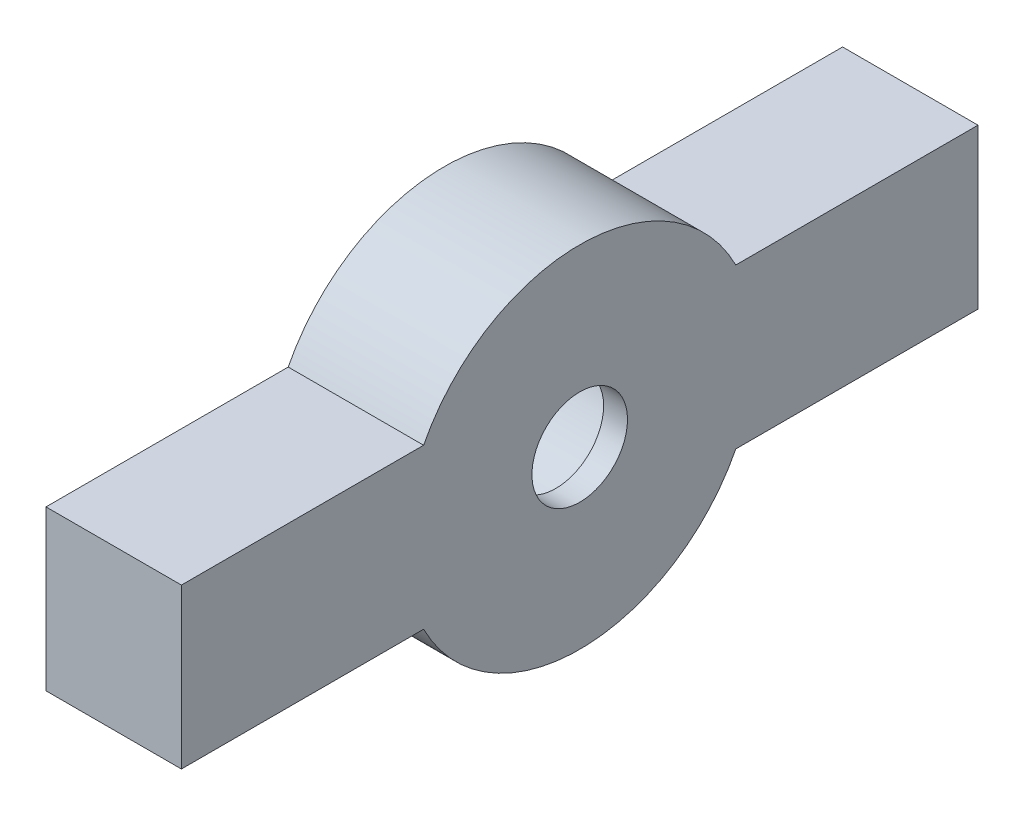
ISO-10303-21;
HEADER;
FILE_DESCRIPTION(('STEP AP214'),'2;1');
FILE_NAME('part.step','',(''),(''),'','','');
FILE_SCHEMA(('AUTOMOTIVE_DESIGN { 1 0 10303 214 1 1 1 1 }'));
ENDSEC;
DATA;
#1=APPLICATION_CONTEXT('core data for automotive mechanical design processes');
#2=APPLICATION_PROTOCOL_DEFINITION('international standard','automotive_design',2000,#1);
#3=PRODUCT_CONTEXT('',#1,'mechanical');
#4=PRODUCT('Part','Part','',(#3));
#5=PRODUCT_RELATED_PRODUCT_CATEGORY('part','',(#4));
#6=PRODUCT_DEFINITION_FORMATION('','',#4);
#7=PRODUCT_DEFINITION_CONTEXT('part definition',#1,'design');
#8=PRODUCT_DEFINITION('design','',#6,#7);
#9=PRODUCT_DEFINITION_SHAPE('','',#8);
#10=(LENGTH_UNIT() NAMED_UNIT(*) SI_UNIT(.MILLI.,.METRE.));
#11=(NAMED_UNIT(*) PLANE_ANGLE_UNIT() SI_UNIT($,.RADIAN.));
#12=(NAMED_UNIT(*) SI_UNIT($,.STERADIAN.) SOLID_ANGLE_UNIT());
#13=UNCERTAINTY_MEASURE_WITH_UNIT(LENGTH_MEASURE(1.E-05),#10,'distance_accuracy_value','');
#14=(GEOMETRIC_REPRESENTATION_CONTEXT(3) GLOBAL_UNCERTAINTY_ASSIGNED_CONTEXT((#13)) GLOBAL_UNIT_ASSIGNED_CONTEXT((#10,
#11,#12)) REPRESENTATION_CONTEXT('',''));
#15=CARTESIAN_POINT('',(0.,0.,0.));
#16=DIRECTION('',(0.,0.,1.));
#17=DIRECTION('',(1.,0.,0.));
#18=AXIS2_PLACEMENT_3D('',#15,#16,#17);
#19=CARTESIAN_POINT('',(3.4,0.,0.));
#20=DIRECTION('',(-1.,0.,0.));
#21=DIRECTION('',(0.,0.,1.));
#22=AXIS2_PLACEMENT_3D('',#19,#20,#21);
#23=CYLINDRICAL_SURFACE('',#22,2.4);
#24=CARTESIAN_POINT('',(0.199999999999999,0.,0.));
#25=DIRECTION('',(1.,0.,0.));
#26=DIRECTION('',(0.,0.,-1.));
#27=AXIS2_PLACEMENT_3D('',#24,#25,#26);
#28=CIRCLE('',#27,2.4);
#29=CARTESIAN_POINT('',(0.199999999999999,0.,2.4));
#30=VERTEX_POINT('',#29);
#31=EDGE_CURVE('E11',#30,#30,#28,.F.);
#32=ORIENTED_EDGE('',*,*,#31,.T.);
#33=EDGE_LOOP('',(#32));
#34=FACE_BOUND('',#33,.T.);
#35=CARTESIAN_POINT('',(2.8,0.,0.));
#36=DIRECTION('',(1.,0.,0.));
#37=DIRECTION('',(0.,0.,-1.));
#38=AXIS2_PLACEMENT_3D('',#35,#36,#37);
#39=CIRCLE('',#38,2.4);
#40=CARTESIAN_POINT('',(2.8,0.,-2.4));
#41=VERTEX_POINT('',#40);
#42=EDGE_CURVE('E157',#41,#41,#39,.T.);
#43=ORIENTED_EDGE('',*,*,#42,.T.);
#44=EDGE_LOOP('',(#43));
#45=FACE_BOUND('',#44,.T.);
#46=ADVANCED_FACE('F47',(#34,#45),#23,.F.);
#47=CARTESIAN_POINT('',(3.4,0.,0.));
#48=DIRECTION('',(-1.,0.,0.));
#49=DIRECTION('',(0.,0.,1.));
#50=AXIS2_PLACEMENT_3D('',#47,#48,#49);
#51=CYLINDRICAL_SURFACE('',#50,4.4);
#52=CARTESIAN_POINT('',(0.,0.,0.));
#53=DIRECTION('',(1.,0.,0.));
#54=DIRECTION('',(0.,0.,-1.));
#55=AXIS2_PLACEMENT_3D('',#52,#53,#54);
#56=CIRCLE('',#55,4.4);
#57=CARTESIAN_POINT('',(0.,-2.,3.91918358845308));
#58=VERTEX_POINT('',#57);
#59=CARTESIAN_POINT('',(0.,-2.,-3.91918358845308));
#60=VERTEX_POINT('',#59);
#61=EDGE_CURVE('E153',#58,#60,#56,.T.);
#62=ORIENTED_EDGE('',*,*,#61,.T.);
#63=DIRECTION('',(-1.,0.,0.));
#64=VECTOR('',#63,1.);
#65=CARTESIAN_POINT('',(3.4,-2.,-3.91918358845308));
#66=LINE('',#65,#64);
#67=CARTESIAN_POINT('',(3.4,-2.,-3.91918358845308));
#68=VERTEX_POINT('',#67);
#69=EDGE_CURVE('E195',#68,#60,#66,.T.);
#70=ORIENTED_EDGE('',*,*,#69,.F.);
#71=CARTESIAN_POINT('',(3.4,0.,0.));
#72=DIRECTION('',(1.,0.,0.));
#73=DIRECTION('',(0.,0.,-1.));
#74=AXIS2_PLACEMENT_3D('',#71,#72,#73);
#75=CIRCLE('',#74,4.4);
#76=CARTESIAN_POINT('',(3.4,-2.,3.91918358845308));
#77=VERTEX_POINT('',#76);
#78=EDGE_CURVE('E105',#77,#68,#75,.T.);
#79=ORIENTED_EDGE('',*,*,#78,.F.);
#80=DIRECTION('',(-1.,0.,0.));
#81=VECTOR('',#80,1.);
#82=CARTESIAN_POINT('',(3.4,-2.,3.91918358845308));
#83=LINE('',#82,#81);
#84=EDGE_CURVE('E66',#77,#58,#83,.T.);
#85=ORIENTED_EDGE('',*,*,#84,.T.);
#86=EDGE_LOOP('',(#62,#70,#79,#85));
#87=FACE_BOUND('',#86,.T.);
#88=ADVANCED_FACE('F214',(#87),#51,.T.);
#89=CARTESIAN_POINT('',(3.4,-2.,0.));
#90=DIRECTION('',(0.,-1.,0.));
#91=DIRECTION('',(0.,0.,-1.));
#92=AXIS2_PLACEMENT_3D('',#89,#90,#91);
#93=PLANE('',#92);
#94=DIRECTION('',(0.,0.,1.));
#95=VECTOR('',#94,1.);
#96=CARTESIAN_POINT('',(0.,-2.,0.));
#97=LINE('',#96,#95);
#98=CARTESIAN_POINT('',(0.,-2.,-10.));
#99=VERTEX_POINT('',#98);
#100=EDGE_CURVE('E156',#99,#60,#97,.T.);
#101=ORIENTED_EDGE('',*,*,#100,.F.);
#102=DIRECTION('',(-1.,0.,0.));
#103=VECTOR('',#102,1.);
#104=CARTESIAN_POINT('',(3.4,-2.,-10.));
#105=LINE('',#104,#103);
#106=CARTESIAN_POINT('',(3.4,-2.,-10.));
#107=VERTEX_POINT('',#106);
#108=EDGE_CURVE('E192',#107,#99,#105,.T.);
#109=ORIENTED_EDGE('',*,*,#108,.F.);
#110=DIRECTION('',(0.,0.,1.));
#111=VECTOR('',#110,1.);
#112=CARTESIAN_POINT('',(3.4,-2.,0.));
#113=LINE('',#112,#111);
#114=EDGE_CURVE('E266',#107,#68,#113,.T.);
#115=ORIENTED_EDGE('',*,*,#114,.T.);
#116=ORIENTED_EDGE('',*,*,#69,.T.);
#117=EDGE_LOOP('',(#101,#109,#115,#116));
#118=FACE_BOUND('',#117,.T.);
#119=ADVANCED_FACE('F218',(#118),#93,.T.);
#120=CARTESIAN_POINT('',(3.4,0.,-10.));
#121=DIRECTION('',(0.,0.,-1.));
#122=DIRECTION('',(-1.,0.,0.));
#123=AXIS2_PLACEMENT_3D('',#120,#121,#122);
#124=PLANE('',#123);
#125=DIRECTION('',(0.,-1.,0.));
#126=VECTOR('',#125,1.);
#127=CARTESIAN_POINT('',(0.,0.,-10.));
#128=LINE('',#127,#126);
#129=CARTESIAN_POINT('',(0.,2.,-10.));
#130=VERTEX_POINT('',#129);
#131=EDGE_CURVE('E161',#130,#99,#128,.T.);
#132=ORIENTED_EDGE('',*,*,#131,.F.);
#133=DIRECTION('',(-1.,0.,0.));
#134=VECTOR('',#133,1.);
#135=CARTESIAN_POINT('',(3.4,2.,-10.));
#136=LINE('',#135,#134);
#137=CARTESIAN_POINT('',(3.4,2.,-10.));
#138=VERTEX_POINT('',#137);
#139=EDGE_CURVE('E189',#138,#130,#136,.T.);
#140=ORIENTED_EDGE('',*,*,#139,.F.);
#141=DIRECTION('',(0.,-1.,0.));
#142=VECTOR('',#141,1.);
#143=CARTESIAN_POINT('',(3.4,0.,-10.));
#144=LINE('',#143,#142);
#145=EDGE_CURVE('E269',#138,#107,#144,.T.);
#146=ORIENTED_EDGE('',*,*,#145,.T.);
#147=ORIENTED_EDGE('',*,*,#108,.T.);
#148=EDGE_LOOP('',(#132,#140,#146,#147));
#149=FACE_BOUND('',#148,.T.);
#150=ADVANCED_FACE('F224',(#149),#124,.T.);
#151=CARTESIAN_POINT('',(3.4,2.,0.));
#152=DIRECTION('',(0.,-1.,0.));
#153=DIRECTION('',(0.,0.,-1.));
#154=AXIS2_PLACEMENT_3D('',#151,#152,#153);
#155=PLANE('',#154);
#156=DIRECTION('',(0.,0.,1.));
#157=VECTOR('',#156,1.);
#158=CARTESIAN_POINT('',(0.,2.,0.));
#159=LINE('',#158,#157);
#160=CARTESIAN_POINT('',(0.,2.,-3.91918358845308));
#161=VERTEX_POINT('',#160);
#162=EDGE_CURVE('E164',#130,#161,#159,.T.);
#163=ORIENTED_EDGE('',*,*,#162,.T.);
#164=DIRECTION('',(-1.,0.,0.));
#165=VECTOR('',#164,1.);
#166=CARTESIAN_POINT('',(3.4,2.,-3.91918358845308));
#167=LINE('',#166,#165);
#168=CARTESIAN_POINT('',(3.4,2.,-3.91918358845308));
#169=VERTEX_POINT('',#168);
#170=EDGE_CURVE('E185',#169,#161,#167,.T.);
#171=ORIENTED_EDGE('',*,*,#170,.F.);
#172=DIRECTION('',(0.,0.,1.));
#173=VECTOR('',#172,1.);
#174=CARTESIAN_POINT('',(3.4,2.,0.));
#175=LINE('',#174,#173);
#176=EDGE_CURVE('E273',#138,#169,#175,.T.);
#177=ORIENTED_EDGE('',*,*,#176,.F.);
#178=ORIENTED_EDGE('',*,*,#139,.T.);
#179=EDGE_LOOP('',(#163,#171,#177,#178));
#180=FACE_BOUND('',#179,.T.);
#181=ADVANCED_FACE('F228',(#180),#155,.F.);
#182=CARTESIAN_POINT('',(3.4,0.,0.));
#183=DIRECTION('',(-1.,0.,0.));
#184=DIRECTION('',(0.,0.,1.));
#185=AXIS2_PLACEMENT_3D('',#182,#183,#184);
#186=CYLINDRICAL_SURFACE('',#185,4.4);
#187=CARTESIAN_POINT('',(0.,0.,0.));
#188=DIRECTION('',(1.,0.,0.));
#189=DIRECTION('',(0.,0.,-1.));
#190=AXIS2_PLACEMENT_3D('',#187,#188,#189);
#191=CIRCLE('',#190,4.4);
#192=CARTESIAN_POINT('',(0.,2.,3.91918358845308));
#193=VERTEX_POINT('',#192);
#194=EDGE_CURVE('E167',#161,#193,#191,.T.);
#195=ORIENTED_EDGE('',*,*,#194,.T.);
#196=DIRECTION('',(-1.,0.,0.));
#197=VECTOR('',#196,1.);
#198=CARTESIAN_POINT('',(3.4,2.,3.91918358845308));
#199=LINE('',#198,#197);
#200=CARTESIAN_POINT('',(3.4,2.,3.91918358845308));
#201=VERTEX_POINT('',#200);
#202=EDGE_CURVE('E141',#201,#193,#199,.T.);
#203=ORIENTED_EDGE('',*,*,#202,.F.);
#204=CARTESIAN_POINT('',(3.4,0.,0.));
#205=DIRECTION('',(1.,0.,0.));
#206=DIRECTION('',(0.,0.,-1.));
#207=AXIS2_PLACEMENT_3D('',#204,#205,#206);
#208=CIRCLE('',#207,4.4);
#209=EDGE_CURVE('E127',#169,#201,#208,.T.);
#210=ORIENTED_EDGE('',*,*,#209,.F.);
#211=ORIENTED_EDGE('',*,*,#170,.T.);
#212=EDGE_LOOP('',(#195,#203,#210,#211));
#213=FACE_BOUND('',#212,.T.);
#214=ADVANCED_FACE('F232',(#213),#186,.T.);
#215=CARTESIAN_POINT('',(3.4,2.,0.));
#216=DIRECTION('',(0.,-1.,0.));
#217=DIRECTION('',(0.,0.,-1.));
#218=AXIS2_PLACEMENT_3D('',#215,#216,#217);
#219=PLANE('',#218);
#220=DIRECTION('',(0.,0.,1.));
#221=VECTOR('',#220,1.);
#222=CARTESIAN_POINT('',(0.,2.,0.));
#223=LINE('',#222,#221);
#224=CARTESIAN_POINT('',(0.,2.,10.));
#225=VERTEX_POINT('',#224);
#226=EDGE_CURVE('E137',#193,#225,#223,.T.);
#227=ORIENTED_EDGE('',*,*,#226,.T.);
#228=DIRECTION('',(-1.,0.,0.));
#229=VECTOR('',#228,1.);
#230=CARTESIAN_POINT('',(3.4,2.,10.));
#231=LINE('',#230,#229);
#232=CARTESIAN_POINT('',(3.4,2.,10.));
#233=VERTEX_POINT('',#232);
#234=EDGE_CURVE('E134',#233,#225,#231,.T.);
#235=ORIENTED_EDGE('',*,*,#234,.F.);
#236=DIRECTION('',(0.,0.,1.));
#237=VECTOR('',#236,1.);
#238=CARTESIAN_POINT('',(3.4,2.,0.));
#239=LINE('',#238,#237);
#240=EDGE_CURVE('E120',#201,#233,#239,.T.);
#241=ORIENTED_EDGE('',*,*,#240,.F.);
#242=ORIENTED_EDGE('',*,*,#202,.T.);
#243=EDGE_LOOP('',(#227,#235,#241,#242));
#244=FACE_BOUND('',#243,.T.);
#245=ADVANCED_FACE('F135',(#244),#219,.F.);
#246=CARTESIAN_POINT('',(3.4,0.,10.));
#247=DIRECTION('',(0.,0.,-1.));
#248=DIRECTION('',(-1.,0.,0.));
#249=AXIS2_PLACEMENT_3D('',#246,#247,#248);
#250=PLANE('',#249);
#251=DIRECTION('',(0.,-1.,0.));
#252=VECTOR('',#251,1.);
#253=CARTESIAN_POINT('',(0.,0.,10.));
#254=LINE('',#253,#252);
#255=CARTESIAN_POINT('',(0.,-2.,10.));
#256=VERTEX_POINT('',#255);
#257=EDGE_CURVE('E172',#225,#256,#254,.T.);
#258=ORIENTED_EDGE('',*,*,#257,.T.);
#259=DIRECTION('',(-1.,0.,0.));
#260=VECTOR('',#259,1.);
#261=CARTESIAN_POINT('',(3.4,-2.,10.));
#262=LINE('',#261,#260);
#263=CARTESIAN_POINT('',(3.4,-2.,10.));
#264=VERTEX_POINT('',#263);
#265=EDGE_CURVE('E93',#264,#256,#262,.T.);
#266=ORIENTED_EDGE('',*,*,#265,.F.);
#267=DIRECTION('',(0.,-1.,0.));
#268=VECTOR('',#267,1.);
#269=CARTESIAN_POINT('',(3.4,0.,10.));
#270=LINE('',#269,#268);
#271=EDGE_CURVE('E125',#233,#264,#270,.T.);
#272=ORIENTED_EDGE('',*,*,#271,.F.);
#273=ORIENTED_EDGE('',*,*,#234,.T.);
#274=EDGE_LOOP('',(#258,#266,#272,#273));
#275=FACE_BOUND('',#274,.T.);
#276=ADVANCED_FACE('F143',(#275),#250,.F.);
#277=CARTESIAN_POINT('',(3.4,-2.,0.));
#278=DIRECTION('',(0.,-1.,0.));
#279=DIRECTION('',(0.,0.,-1.));
#280=AXIS2_PLACEMENT_3D('',#277,#278,#279);
#281=PLANE('',#280);
#282=DIRECTION('',(0.,0.,1.));
#283=VECTOR('',#282,1.);
#284=CARTESIAN_POINT('',(0.,-2.,0.));
#285=LINE('',#284,#283);
#286=EDGE_CURVE('E175',#58,#256,#285,.T.);
#287=ORIENTED_EDGE('',*,*,#286,.F.);
#288=ORIENTED_EDGE('',*,*,#84,.F.);
#289=DIRECTION('',(0.,0.,1.));
#290=VECTOR('',#289,1.);
#291=CARTESIAN_POINT('',(3.4,-2.,0.));
#292=LINE('',#291,#290);
#293=EDGE_CURVE('E145',#77,#264,#292,.T.);
#294=ORIENTED_EDGE('',*,*,#293,.T.);
#295=ORIENTED_EDGE('',*,*,#265,.T.);
#296=EDGE_LOOP('',(#287,#288,#294,#295));
#297=FACE_BOUND('',#296,.T.);
#298=ADVANCED_FACE('F241',(#297),#281,.T.);
#299=CARTESIAN_POINT('',(3.4,0.,0.));
#300=DIRECTION('',(1.,0.,0.));
#301=DIRECTION('',(0.,0.,-1.));
#302=AXIS2_PLACEMENT_3D('',#299,#300,#301);
#303=PLANE('',#302);
#304=ORIENTED_EDGE('',*,*,#78,.T.);
#305=ORIENTED_EDGE('',*,*,#114,.F.);
#306=ORIENTED_EDGE('',*,*,#145,.F.);
#307=ORIENTED_EDGE('',*,*,#176,.T.);
#308=ORIENTED_EDGE('',*,*,#209,.T.);
#309=ORIENTED_EDGE('',*,*,#240,.T.);
#310=ORIENTED_EDGE('',*,*,#271,.T.);
#311=ORIENTED_EDGE('',*,*,#293,.F.);
#312=EDGE_LOOP('',(#304,#305,#306,#307,#308,#309,#310,#311));
#313=FACE_BOUND('',#312,.T.);
#314=CARTESIAN_POINT('',(3.4,0.,0.));
#315=DIRECTION('',(1.,0.,0.));
#316=DIRECTION('',(0.,0.,-1.));
#317=AXIS2_PLACEMENT_3D('',#314,#315,#316);
#318=CIRCLE('',#317,1.2);
#319=CARTESIAN_POINT('',(3.4,0.,-1.2));
#320=VERTEX_POINT('',#319);
#321=EDGE_CURVE('E260',#320,#320,#318,.T.);
#322=ORIENTED_EDGE('',*,*,#321,.F.);
#323=EDGE_LOOP('',(#322));
#324=FACE_BOUND('',#323,.T.);
#325=ADVANCED_FACE('F122',(#313,#324),#303,.T.);
#326=CARTESIAN_POINT('',(0.,0.,0.));
#327=DIRECTION('',(1.,0.,0.));
#328=DIRECTION('',(0.,0.,-1.));
#329=AXIS2_PLACEMENT_3D('',#326,#327,#328);
#330=PLANE('',#329);
#331=CARTESIAN_POINT('',(0.,0.,0.));
#332=DIRECTION('',(1.,0.,0.));
#333=DIRECTION('',(0.,0.,-1.));
#334=AXIS2_PLACEMENT_3D('',#331,#332,#333);
#335=CIRCLE('',#334,2.59999999999999);
#336=CARTESIAN_POINT('',(0.,0.,2.59999999999999));
#337=VERTEX_POINT('',#336);
#338=EDGE_CURVE('E58',#337,#337,#335,.T.);
#339=ORIENTED_EDGE('',*,*,#338,.T.);
#340=EDGE_LOOP('',(#339));
#341=FACE_BOUND('',#340,.T.);
#342=ORIENTED_EDGE('',*,*,#61,.F.);
#343=ORIENTED_EDGE('',*,*,#286,.T.);
#344=ORIENTED_EDGE('',*,*,#257,.F.);
#345=ORIENTED_EDGE('',*,*,#226,.F.);
#346=ORIENTED_EDGE('',*,*,#194,.F.);
#347=ORIENTED_EDGE('',*,*,#162,.F.);
#348=ORIENTED_EDGE('',*,*,#131,.T.);
#349=ORIENTED_EDGE('',*,*,#100,.T.);
#350=EDGE_LOOP('',(#342,#343,#344,#345,#346,#347,#348,#349));
#351=FACE_BOUND('',#350,.T.);
#352=ADVANCED_FACE('F201',(#341,#351),#330,.F.);
#353=CARTESIAN_POINT('',(2.8,0.,0.));
#354=DIRECTION('',(1.,0.,0.));
#355=DIRECTION('',(0.,0.,-1.));
#356=AXIS2_PLACEMENT_3D('',#353,#354,#355);
#357=PLANE('',#356);
#358=CARTESIAN_POINT('',(2.8,0.,0.));
#359=DIRECTION('',(1.,0.,0.));
#360=DIRECTION('',(0.,0.,-1.));
#361=AXIS2_PLACEMENT_3D('',#358,#359,#360);
#362=CIRCLE('',#361,1.2);
#363=CARTESIAN_POINT('',(2.8,0.,-1.2));
#364=VERTEX_POINT('',#363);
#365=EDGE_CURVE('E254',#364,#364,#362,.T.);
#366=ORIENTED_EDGE('',*,*,#365,.T.);
#367=EDGE_LOOP('',(#366));
#368=FACE_BOUND('',#367,.T.);
#369=ORIENTED_EDGE('',*,*,#42,.F.);
#370=EDGE_LOOP('',(#369));
#371=FACE_BOUND('',#370,.T.);
#372=ADVANCED_FACE('F209',(#368,#371),#357,.F.);
#373=CARTESIAN_POINT('',(2.8,0.,0.));
#374=DIRECTION('',(1.,0.,0.));
#375=DIRECTION('',(0.,0.,-1.));
#376=AXIS2_PLACEMENT_3D('',#373,#374,#375);
#377=CYLINDRICAL_SURFACE('',#376,1.2);
#378=ORIENTED_EDGE('',*,*,#365,.F.);
#379=EDGE_LOOP('',(#378));
#380=FACE_BOUND('',#379,.T.);
#381=ORIENTED_EDGE('',*,*,#321,.T.);
#382=EDGE_LOOP('',(#381));
#383=FACE_BOUND('',#382,.T.);
#384=ADVANCED_FACE('F205',(#380,#383),#377,.F.);
#385=CARTESIAN_POINT('',(0.,0.,0.));
#386=DIRECTION('',(-1.,0.,0.));
#387=DIRECTION('',(0.,0.,1.));
#388=AXIS2_PLACEMENT_3D('',#385,#386,#387);
#389=CONICAL_SURFACE('',#388,2.59999999999999,0.785398163397438);
#390=CARTESIAN_POINT('',(0.199999999999999,0.,2.4));
#391=CARTESIAN_POINT('',(0.197916666666666,0.,2.40208333333333));
#392=CARTESIAN_POINT('',(0.195833333333333,0.,2.40416666666667));
#393=CARTESIAN_POINT('',(0.191666666666666,0.,2.40833333333333));
#394=CARTESIAN_POINT('',(0.189583333333333,0.,2.41041666666667));
#395=CARTESIAN_POINT('',(0.185416666666666,0.,2.41458333333333));
#396=CARTESIAN_POINT('',(0.183333333333333,0.,2.41666666666667));
#397=CARTESIAN_POINT('',(0.179166666666666,0.,2.42083333333333));
#398=CARTESIAN_POINT('',(0.177083333333333,0.,2.42291666666667));
#399=CARTESIAN_POINT('',(0.172916666666666,0.,2.42708333333333));
#400=CARTESIAN_POINT('',(0.170833333333333,0.,2.42916666666667));
#401=CARTESIAN_POINT('',(0.166666666666666,0.,2.43333333333333));
#402=CARTESIAN_POINT('',(0.164583333333333,0.,2.43541666666667));
#403=CARTESIAN_POINT('',(0.160416666666666,0.,2.43958333333333));
#404=CARTESIAN_POINT('',(0.158333333333333,0.,2.44166666666667));
#405=CARTESIAN_POINT('',(0.154166666666666,0.,2.44583333333333));
#406=CARTESIAN_POINT('',(0.152083333333333,0.,2.44791666666667));
#407=CARTESIAN_POINT('',(0.147916666666666,0.,2.45208333333333));
#408=CARTESIAN_POINT('',(0.145833333333333,0.,2.45416666666667));
#409=CARTESIAN_POINT('',(0.141666666666666,0.,2.45833333333333));
#410=CARTESIAN_POINT('',(0.139583333333333,0.,2.46041666666666));
#411=CARTESIAN_POINT('',(0.135416666666666,0.,2.46458333333333));
#412=CARTESIAN_POINT('',(0.133333333333333,0.,2.46666666666666));
#413=CARTESIAN_POINT('',(0.129166666666666,0.,2.47083333333333));
#414=CARTESIAN_POINT('',(0.127083333333333,0.,2.47291666666666));
#415=CARTESIAN_POINT('',(0.122916666666666,0.,2.47708333333333));
#416=CARTESIAN_POINT('',(0.120833333333333,0.,2.47916666666666));
#417=CARTESIAN_POINT('',(0.116666666666666,0.,2.48333333333333));
#418=CARTESIAN_POINT('',(0.114583333333333,0.,2.48541666666666));
#419=CARTESIAN_POINT('',(0.110416666666666,0.,2.48958333333333));
#420=CARTESIAN_POINT('',(0.108333333333333,0.,2.49166666666666));
#421=CARTESIAN_POINT('',(0.104166666666666,0.,2.49583333333333));
#422=CARTESIAN_POINT('',(0.102083333333333,0.,2.49791666666666));
#423=CARTESIAN_POINT('',(0.0979166666666662,0.,2.50208333333333));
#424=CARTESIAN_POINT('',(0.095833333333333,0.,2.50416666666666));
#425=CARTESIAN_POINT('',(0.0916666666666663,0.,2.50833333333333));
#426=CARTESIAN_POINT('',(0.089583333333333,0.,2.51041666666666));
#427=CARTESIAN_POINT('',(0.0854166666666663,0.,2.51458333333333));
#428=CARTESIAN_POINT('',(0.083333333333333,0.,2.51666666666666));
#429=CARTESIAN_POINT('',(0.0791666666666663,0.,2.52083333333333));
#430=CARTESIAN_POINT('',(0.077083333333333,0.,2.52291666666666));
#431=CARTESIAN_POINT('',(0.0729166666666664,0.,2.52708333333333));
#432=CARTESIAN_POINT('',(0.0708333333333331,0.,2.52916666666666));
#433=CARTESIAN_POINT('',(0.0666666666666665,0.,2.53333333333333));
#434=CARTESIAN_POINT('',(0.0645833333333331,0.,2.53541666666666));
#435=CARTESIAN_POINT('',(0.0604166666666664,0.,2.53958333333333));
#436=CARTESIAN_POINT('',(0.0583333333333331,0.,2.54166666666666));
#437=CARTESIAN_POINT('',(0.0541666666666664,0.,2.54583333333333));
#438=CARTESIAN_POINT('',(0.0520833333333331,0.,2.54791666666666));
#439=CARTESIAN_POINT('',(0.0479166666666665,0.,2.55208333333333));
#440=CARTESIAN_POINT('',(0.0458333333333331,0.,2.55416666666666));
#441=CARTESIAN_POINT('',(0.0416666666666665,0.,2.55833333333333));
#442=CARTESIAN_POINT('',(0.0395833333333332,0.,2.56041666666666));
#443=CARTESIAN_POINT('',(0.0354166666666666,0.,2.56458333333333));
#444=CARTESIAN_POINT('',(0.0333333333333332,0.,2.56666666666666));
#445=CARTESIAN_POINT('',(0.0291666666666665,0.,2.57083333333333));
#446=CARTESIAN_POINT('',(0.0270833333333332,0.,2.57291666666666));
#447=CARTESIAN_POINT('',(0.0229166666666666,0.,2.57708333333333));
#448=CARTESIAN_POINT('',(0.0208333333333332,0.,2.57916666666666));
#449=CARTESIAN_POINT('',(0.0166666666666666,0.,2.58333333333333));
#450=CARTESIAN_POINT('',(0.0145833333333333,0.,2.58541666666666));
#451=CARTESIAN_POINT('',(0.0104166666666667,0.,2.58958333333333));
#452=CARTESIAN_POINT('',(0.00833333333333331,0.,2.59166666666666));
#453=CARTESIAN_POINT('',(0.00416666666666661,0.,2.59583333333333));
#454=CARTESIAN_POINT('',(0.00208333333333327,0.,2.59791666666666));
#455=CARTESIAN_POINT('',(0.,0.,2.59999999999999));
#456=B_SPLINE_CURVE_WITH_KNOTS('',3,(#390,#391,#392,#393,#394,#395,#396,#397,#398,#399,#400,
#401,#402,#403,#404,#405,#406,#407,#408,#409,#410,#411,#412,#413,#414,#415,#416,#417,#418,#419,
#420,#421,#422,#423,#424,#425,#426,#427,#428,#429,#430,#431,#432,#433,#434,#435,#436,#437,#438,
#439,#440,#441,#442,#443,#444,#445,#446,#447,#448,#449,#450,#451,#452,#453,#454,#455),
.UNSPECIFIED.,.F.,.F.,(4,2,2,2,2,2,2,2,2,2,2,2,2,2,2,2,2,2,2,2,2,2,2,2,2,2,2,2,2,2,2,2,4),(0.,
0.00883883476483164,0.0176776695296633,0.0265165042944953,0.0353553390593269,0.0441941738241585,
0.0530330085889902,0.0618718433538222,0.0707106781186538,0.0795495128834854,0.0883883476483171,
0.0972271824131487,0.106066017177981,0.114904851942812,0.123743686707644,0.132582521472476,
0.141421356237307,0.150260191002139,0.159099025766971,0.167937860531802,0.176776695296634,
0.185615530061466,0.194454364826298,0.203293199591129,0.212132034355961,0.220970869120793,
0.229809703885625,0.238648538650456,0.247487373415288,0.25632620818012,0.265165042944952,
0.274003877709783,0.282842712474615),.UNSPECIFIED.);
#457=EDGE_CURVE('BSEAM50',#30,#337,#456,.T.);
#458=ORIENTED_EDGE('',*,*,#31,.F.);
#459=ORIENTED_EDGE('',*,*,#338,.F.);
#460=ORIENTED_EDGE('',*,*,#457,.T.);
#461=ORIENTED_EDGE('',*,*,#457,.F.);
#462=EDGE_LOOP('',(#458,#460,#459,#461));
#463=FACE_BOUND('',#462,.T.);
#464=ADVANCED_FACE('F50',(#463),#389,.F.);
#465=CLOSED_SHELL('',(#46,#88,#119,#150,#181,#214,#245,#276,#298,#325,#352,#372,#384,#464));
#466=MANIFOLD_SOLID_BREP('B2',#465);
#467=ADVANCED_BREP_SHAPE_REPRESENTATION('',(#18,#466),#14);
#468=SHAPE_DEFINITION_REPRESENTATION(#9,#467);
ENDSEC;
END-ISO-10303-21;
